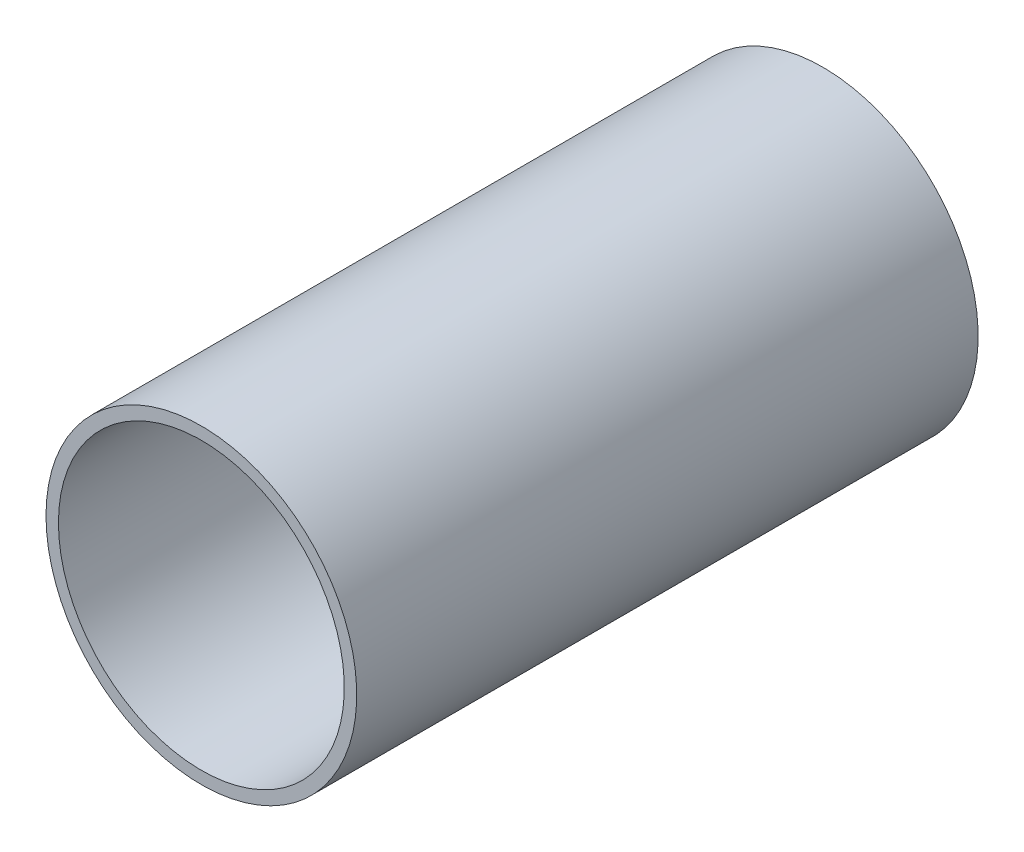
ISO-10303-21;
HEADER;
FILE_DESCRIPTION(('STEP AP214'),'2;1');
FILE_NAME('part.step','',(''),(''),'','','');
FILE_SCHEMA(('AUTOMOTIVE_DESIGN { 1 0 10303 214 1 1 1 1 }'));
ENDSEC;
DATA;
#1=APPLICATION_CONTEXT('core data for automotive mechanical design processes');
#2=APPLICATION_PROTOCOL_DEFINITION('international standard','automotive_design',2000,#1);
#3=PRODUCT_CONTEXT('',#1,'mechanical');
#4=PRODUCT('Part','Part','',(#3));
#5=PRODUCT_RELATED_PRODUCT_CATEGORY('part','',(#4));
#6=PRODUCT_DEFINITION_FORMATION('','',#4);
#7=PRODUCT_DEFINITION_CONTEXT('part definition',#1,'design');
#8=PRODUCT_DEFINITION('design','',#6,#7);
#9=PRODUCT_DEFINITION_SHAPE('','',#8);
#10=(LENGTH_UNIT() NAMED_UNIT(*) SI_UNIT(.MILLI.,.METRE.));
#11=(NAMED_UNIT(*) PLANE_ANGLE_UNIT() SI_UNIT($,.RADIAN.));
#12=(NAMED_UNIT(*) SI_UNIT($,.STERADIAN.) SOLID_ANGLE_UNIT());
#13=UNCERTAINTY_MEASURE_WITH_UNIT(LENGTH_MEASURE(1.E-05),#10,'distance_accuracy_value','');
#14=(GEOMETRIC_REPRESENTATION_CONTEXT(3) GLOBAL_UNCERTAINTY_ASSIGNED_CONTEXT((#13)) GLOBAL_UNIT_ASSIGNED_CONTEXT((#10,
#11,#12)) REPRESENTATION_CONTEXT('',''));
#15=CARTESIAN_POINT('',(0.,0.,0.));
#16=DIRECTION('',(0.,0.,1.));
#17=DIRECTION('',(1.,0.,0.));
#18=AXIS2_PLACEMENT_3D('',#15,#16,#17);
#19=CARTESIAN_POINT('',(0.,0.,152.4));
#20=DIRECTION('',(0.,0.,1.));
#21=DIRECTION('',(1.,0.,0.));
#22=AXIS2_PLACEMENT_3D('',#19,#20,#21);
#23=PLANE('',#22);
#24=CARTESIAN_POINT('',(0.,0.,152.4));
#25=DIRECTION('',(0.,0.,1.));
#26=DIRECTION('',(1.,0.,0.));
#27=AXIS2_PLACEMENT_3D('',#24,#25,#26);
#28=CIRCLE('',#27,38.1);
#29=CARTESIAN_POINT('',(-38.1,0.,152.4));
#30=VERTEX_POINT('',#29);
#31=EDGE_CURVE('E10',#30,#30,#28,.T.);
#32=ORIENTED_EDGE('',*,*,#31,.T.);
#33=EDGE_LOOP('',(#32));
#34=FACE_BOUND('',#33,.T.);
#35=CARTESIAN_POINT('',(0.,0.,152.4));
#36=DIRECTION('',(0.,0.,1.));
#37=DIRECTION('',(1.,0.,0.));
#38=AXIS2_PLACEMENT_3D('',#35,#36,#37);
#39=CIRCLE('',#38,35.052);
#40=CARTESIAN_POINT('',(-35.052,0.,152.4));
#41=VERTEX_POINT('',#40);
#42=EDGE_CURVE('E46',#41,#41,#39,.T.);
#43=ORIENTED_EDGE('',*,*,#42,.F.);
#44=EDGE_LOOP('',(#43));
#45=FACE_BOUND('',#44,.T.);
#46=ADVANCED_FACE('F35',(#34,#45),#23,.T.);
#47=CARTESIAN_POINT('',(0.,0.,0.));
#48=DIRECTION('',(0.,0.,1.));
#49=DIRECTION('',(1.,0.,0.));
#50=AXIS2_PLACEMENT_3D('',#47,#48,#49);
#51=PLANE('',#50);
#52=CARTESIAN_POINT('',(0.,0.,0.));
#53=DIRECTION('',(0.,0.,1.));
#54=DIRECTION('',(1.,0.,0.));
#55=AXIS2_PLACEMENT_3D('',#52,#53,#54);
#56=CIRCLE('',#55,38.1);
#57=CARTESIAN_POINT('',(-38.1,0.,0.));
#58=VERTEX_POINT('',#57);
#59=EDGE_CURVE('E39',#58,#58,#56,.T.);
#60=ORIENTED_EDGE('',*,*,#59,.F.);
#61=EDGE_LOOP('',(#60));
#62=FACE_BOUND('',#61,.T.);
#63=CARTESIAN_POINT('',(0.,0.,0.));
#64=DIRECTION('',(0.,0.,1.));
#65=DIRECTION('',(1.,0.,0.));
#66=AXIS2_PLACEMENT_3D('',#63,#64,#65);
#67=CIRCLE('',#66,35.052);
#68=CARTESIAN_POINT('',(-35.052,0.,0.));
#69=VERTEX_POINT('',#68);
#70=EDGE_CURVE('E48',#69,#69,#67,.T.);
#71=ORIENTED_EDGE('',*,*,#70,.T.);
#72=EDGE_LOOP('',(#71));
#73=FACE_BOUND('',#72,.T.);
#74=ADVANCED_FACE('F58',(#62,#73),#51,.F.);
#75=CARTESIAN_POINT('',(0.,0.,152.4));
#76=DIRECTION('',(0.,0.,-1.));
#77=DIRECTION('',(-1.,0.,0.));
#78=AXIS2_PLACEMENT_3D('',#75,#76,#77);
#79=CYLINDRICAL_SURFACE('',#78,38.1);
#80=CARTESIAN_POINT('',(-38.1,0.,152.4));
#81=CARTESIAN_POINT('',(-38.1,0.,150.8125));
#82=CARTESIAN_POINT('',(-38.1,0.,149.225));
#83=CARTESIAN_POINT('',(-38.1,0.,146.05));
#84=CARTESIAN_POINT('',(-38.1,0.,144.4625));
#85=CARTESIAN_POINT('',(-38.1,0.,141.2875));
#86=CARTESIAN_POINT('',(-38.1,0.,139.7));
#87=CARTESIAN_POINT('',(-38.1,0.,136.525));
#88=CARTESIAN_POINT('',(-38.1,0.,134.9375));
#89=CARTESIAN_POINT('',(-38.1,0.,131.7625));
#90=CARTESIAN_POINT('',(-38.1,0.,130.175));
#91=CARTESIAN_POINT('',(-38.1,0.,127.));
#92=CARTESIAN_POINT('',(-38.1,0.,125.4125));
#93=CARTESIAN_POINT('',(-38.1,0.,122.2375));
#94=CARTESIAN_POINT('',(-38.1,0.,120.65));
#95=CARTESIAN_POINT('',(-38.1,0.,117.475));
#96=CARTESIAN_POINT('',(-38.1,0.,115.8875));
#97=CARTESIAN_POINT('',(-38.1,0.,112.7125));
#98=CARTESIAN_POINT('',(-38.1,0.,111.125));
#99=CARTESIAN_POINT('',(-38.1,0.,107.95));
#100=CARTESIAN_POINT('',(-38.1,0.,106.3625));
#101=CARTESIAN_POINT('',(-38.1,0.,103.1875));
#102=CARTESIAN_POINT('',(-38.1,0.,101.6));
#103=CARTESIAN_POINT('',(-38.1,0.,98.425));
#104=CARTESIAN_POINT('',(-38.1,0.,96.8375));
#105=CARTESIAN_POINT('',(-38.1,0.,93.6625));
#106=CARTESIAN_POINT('',(-38.1,0.,92.075));
#107=CARTESIAN_POINT('',(-38.1,0.,88.9));
#108=CARTESIAN_POINT('',(-38.1,0.,87.3125));
#109=CARTESIAN_POINT('',(-38.1,0.,84.1375));
#110=CARTESIAN_POINT('',(-38.1,0.,82.55));
#111=CARTESIAN_POINT('',(-38.1,0.,79.375));
#112=CARTESIAN_POINT('',(-38.1,0.,77.7875));
#113=CARTESIAN_POINT('',(-38.1,0.,74.6125));
#114=CARTESIAN_POINT('',(-38.1,0.,73.025));
#115=CARTESIAN_POINT('',(-38.1,0.,69.85));
#116=CARTESIAN_POINT('',(-38.1,0.,68.2625));
#117=CARTESIAN_POINT('',(-38.1,0.,65.0875));
#118=CARTESIAN_POINT('',(-38.1,0.,63.5));
#119=CARTESIAN_POINT('',(-38.1,0.,60.325));
#120=CARTESIAN_POINT('',(-38.1,0.,58.7375));
#121=CARTESIAN_POINT('',(-38.1,0.,55.5625));
#122=CARTESIAN_POINT('',(-38.1,0.,53.975));
#123=CARTESIAN_POINT('',(-38.1,0.,50.8));
#124=CARTESIAN_POINT('',(-38.1,0.,49.2125));
#125=CARTESIAN_POINT('',(-38.1,0.,46.0375));
#126=CARTESIAN_POINT('',(-38.1,0.,44.45));
#127=CARTESIAN_POINT('',(-38.1,0.,41.275));
#128=CARTESIAN_POINT('',(-38.1,0.,39.6875));
#129=CARTESIAN_POINT('',(-38.1,0.,36.5125));
#130=CARTESIAN_POINT('',(-38.1,0.,34.925));
#131=CARTESIAN_POINT('',(-38.1,0.,31.75));
#132=CARTESIAN_POINT('',(-38.1,0.,30.1625));
#133=CARTESIAN_POINT('',(-38.1,0.,26.9875));
#134=CARTESIAN_POINT('',(-38.1,0.,25.4));
#135=CARTESIAN_POINT('',(-38.1,0.,22.225));
#136=CARTESIAN_POINT('',(-38.1,0.,20.6375));
#137=CARTESIAN_POINT('',(-38.1,0.,17.4625));
#138=CARTESIAN_POINT('',(-38.1,0.,15.875));
#139=CARTESIAN_POINT('',(-38.1,0.,12.7));
#140=CARTESIAN_POINT('',(-38.1,0.,11.1125));
#141=CARTESIAN_POINT('',(-38.1,0.,7.93750000000001));
#142=CARTESIAN_POINT('',(-38.1,0.,6.35));
#143=CARTESIAN_POINT('',(-38.1,0.,3.175));
#144=CARTESIAN_POINT('',(-38.1,0.,1.5875));
#145=CARTESIAN_POINT('',(-38.1,0.,0.));
#146=B_SPLINE_CURVE_WITH_KNOTS('',3,(#80,#81,#82,#83,#84,#85,#86,#87,#88,#89,#90,#91,#92,#93,
#94,#95,#96,#97,#98,#99,#100,#101,#102,#103,#104,#105,#106,#107,#108,#109,#110,#111,#112,#113,
#114,#115,#116,#117,#118,#119,#120,#121,#122,#123,#124,#125,#126,#127,#128,#129,#130,#131,#132,
#133,#134,#135,#136,#137,#138,#139,#140,#141,#142,#143,#144,#145),.UNSPECIFIED.,.F.,.F.,(4,2,2,
2,2,2,2,2,2,2,2,2,2,2,2,2,2,2,2,2,2,2,2,2,2,2,2,2,2,2,2,2,4),(0.,4.7625,9.52500000000001,
14.2875,19.05,23.8125,28.575,33.3375,38.1,42.8625,47.625,52.3875,57.15,61.9125,66.675,71.4375,
76.2,80.9625,85.725,90.4875,95.25,100.0125,104.775,109.5375,114.3,119.0625,123.825,128.5875,
133.35,138.1125,142.875,147.6375,152.4),.UNSPECIFIED.);
#147=EDGE_CURVE('BSEAM37',#30,#58,#146,.T.);
#148=ORIENTED_EDGE('',*,*,#31,.F.);
#149=ORIENTED_EDGE('',*,*,#59,.T.);
#150=ORIENTED_EDGE('',*,*,#147,.T.);
#151=ORIENTED_EDGE('',*,*,#147,.F.);
#152=EDGE_LOOP('',(#148,#150,#149,#151));
#153=FACE_BOUND('',#152,.T.);
#154=ADVANCED_FACE('F37',(#153),#79,.T.);
#155=CARTESIAN_POINT('',(0.,0.,152.4));
#156=DIRECTION('',(0.,0.,-1.));
#157=DIRECTION('',(-1.,0.,0.));
#158=AXIS2_PLACEMENT_3D('',#155,#156,#157);
#159=CYLINDRICAL_SURFACE('',#158,35.052);
#160=CARTESIAN_POINT('',(-35.052,0.,152.4));
#161=CARTESIAN_POINT('',(-35.052,0.,150.8125));
#162=CARTESIAN_POINT('',(-35.052,0.,149.225));
#163=CARTESIAN_POINT('',(-35.052,0.,146.05));
#164=CARTESIAN_POINT('',(-35.052,0.,144.4625));
#165=CARTESIAN_POINT('',(-35.052,0.,141.2875));
#166=CARTESIAN_POINT('',(-35.052,0.,139.7));
#167=CARTESIAN_POINT('',(-35.052,0.,136.525));
#168=CARTESIAN_POINT('',(-35.052,0.,134.9375));
#169=CARTESIAN_POINT('',(-35.052,0.,131.7625));
#170=CARTESIAN_POINT('',(-35.052,0.,130.175));
#171=CARTESIAN_POINT('',(-35.052,0.,127.));
#172=CARTESIAN_POINT('',(-35.052,0.,125.4125));
#173=CARTESIAN_POINT('',(-35.052,0.,122.2375));
#174=CARTESIAN_POINT('',(-35.052,0.,120.65));
#175=CARTESIAN_POINT('',(-35.052,0.,117.475));
#176=CARTESIAN_POINT('',(-35.052,0.,115.8875));
#177=CARTESIAN_POINT('',(-35.052,0.,112.7125));
#178=CARTESIAN_POINT('',(-35.052,0.,111.125));
#179=CARTESIAN_POINT('',(-35.052,0.,107.95));
#180=CARTESIAN_POINT('',(-35.052,0.,106.3625));
#181=CARTESIAN_POINT('',(-35.052,0.,103.1875));
#182=CARTESIAN_POINT('',(-35.052,0.,101.6));
#183=CARTESIAN_POINT('',(-35.052,0.,98.425));
#184=CARTESIAN_POINT('',(-35.052,0.,96.8375));
#185=CARTESIAN_POINT('',(-35.052,0.,93.6625));
#186=CARTESIAN_POINT('',(-35.052,0.,92.075));
#187=CARTESIAN_POINT('',(-35.052,0.,88.9));
#188=CARTESIAN_POINT('',(-35.052,0.,87.3125));
#189=CARTESIAN_POINT('',(-35.052,0.,84.1375));
#190=CARTESIAN_POINT('',(-35.052,0.,82.55));
#191=CARTESIAN_POINT('',(-35.052,0.,79.375));
#192=CARTESIAN_POINT('',(-35.052,0.,77.7875));
#193=CARTESIAN_POINT('',(-35.052,0.,74.6125));
#194=CARTESIAN_POINT('',(-35.052,0.,73.025));
#195=CARTESIAN_POINT('',(-35.052,0.,69.85));
#196=CARTESIAN_POINT('',(-35.052,0.,68.2625));
#197=CARTESIAN_POINT('',(-35.052,0.,65.0875));
#198=CARTESIAN_POINT('',(-35.052,0.,63.5));
#199=CARTESIAN_POINT('',(-35.052,0.,60.325));
#200=CARTESIAN_POINT('',(-35.052,0.,58.7375));
#201=CARTESIAN_POINT('',(-35.052,0.,55.5625));
#202=CARTESIAN_POINT('',(-35.052,0.,53.975));
#203=CARTESIAN_POINT('',(-35.052,0.,50.8));
#204=CARTESIAN_POINT('',(-35.052,0.,49.2125));
#205=CARTESIAN_POINT('',(-35.052,0.,46.0375));
#206=CARTESIAN_POINT('',(-35.052,0.,44.45));
#207=CARTESIAN_POINT('',(-35.052,0.,41.275));
#208=CARTESIAN_POINT('',(-35.052,0.,39.6875));
#209=CARTESIAN_POINT('',(-35.052,0.,36.5125));
#210=CARTESIAN_POINT('',(-35.052,0.,34.925));
#211=CARTESIAN_POINT('',(-35.052,0.,31.75));
#212=CARTESIAN_POINT('',(-35.052,0.,30.1625));
#213=CARTESIAN_POINT('',(-35.052,0.,26.9875));
#214=CARTESIAN_POINT('',(-35.052,0.,25.4));
#215=CARTESIAN_POINT('',(-35.052,0.,22.225));
#216=CARTESIAN_POINT('',(-35.052,0.,20.6375));
#217=CARTESIAN_POINT('',(-35.052,0.,17.4625));
#218=CARTESIAN_POINT('',(-35.052,0.,15.875));
#219=CARTESIAN_POINT('',(-35.052,0.,12.7));
#220=CARTESIAN_POINT('',(-35.052,0.,11.1125));
#221=CARTESIAN_POINT('',(-35.052,0.,7.93750000000001));
#222=CARTESIAN_POINT('',(-35.052,0.,6.35));
#223=CARTESIAN_POINT('',(-35.052,0.,3.175));
#224=CARTESIAN_POINT('',(-35.052,0.,1.5875));
#225=CARTESIAN_POINT('',(-35.052,0.,0.));
#226=B_SPLINE_CURVE_WITH_KNOTS('',3,(#160,#161,#162,#163,#164,#165,#166,#167,#168,#169,#170,
#171,#172,#173,#174,#175,#176,#177,#178,#179,#180,#181,#182,#183,#184,#185,#186,#187,#188,#189,
#190,#191,#192,#193,#194,#195,#196,#197,#198,#199,#200,#201,#202,#203,#204,#205,#206,#207,#208,
#209,#210,#211,#212,#213,#214,#215,#216,#217,#218,#219,#220,#221,#222,#223,#224,#225),
.UNSPECIFIED.,.F.,.F.,(4,2,2,2,2,2,2,2,2,2,2,2,2,2,2,2,2,2,2,2,2,2,2,2,2,2,2,2,2,2,2,2,4),(0.,
4.7625,9.52500000000001,14.2875,19.05,23.8125,28.575,33.3375,38.1,42.8625,47.625,52.3875,57.15,
61.9125,66.675,71.4375,76.2,80.9625,85.725,90.4875,95.25,100.0125,104.775,109.5375,114.3,
119.0625,123.825,128.5875,133.35,138.1125,142.875,147.6375,152.4),.UNSPECIFIED.);
#227=EDGE_CURVE('BSEAM54',#41,#69,#226,.T.);
#228=ORIENTED_EDGE('',*,*,#42,.T.);
#229=ORIENTED_EDGE('',*,*,#70,.F.);
#230=ORIENTED_EDGE('',*,*,#227,.T.);
#231=ORIENTED_EDGE('',*,*,#227,.F.);
#232=EDGE_LOOP('',(#228,#230,#229,#231));
#233=FACE_BOUND('',#232,.T.);
#234=ADVANCED_FACE('F54',(#233),#159,.F.);
#235=CLOSED_SHELL('',(#46,#74,#154,#234));
#236=MANIFOLD_SOLID_BREP('B2',#235);
#237=ADVANCED_BREP_SHAPE_REPRESENTATION('',(#18,#236),#14);
#238=SHAPE_DEFINITION_REPRESENTATION(#9,#237);
ENDSEC;
END-ISO-10303-21;
